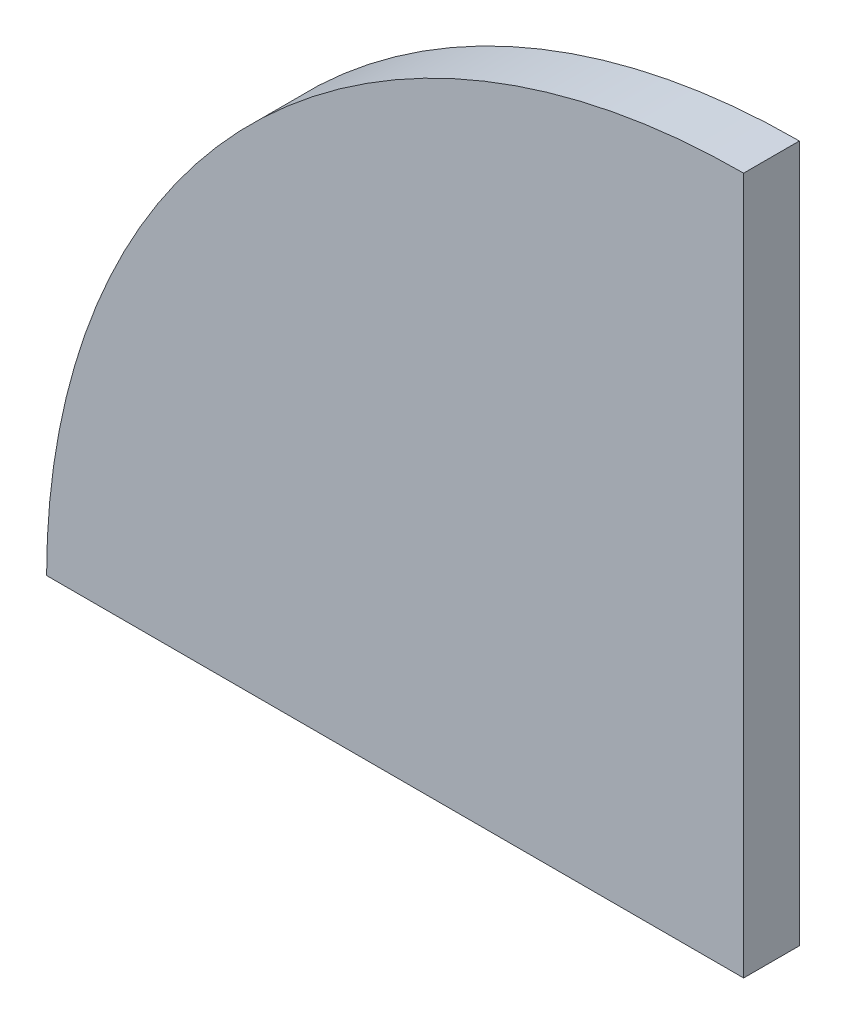
ISO-10303-21;
HEADER;
FILE_DESCRIPTION(('STEP AP214'),'2;1');
FILE_NAME('part.step','',(''),(''),'','','');
FILE_SCHEMA(('AUTOMOTIVE_DESIGN { 1 0 10303 214 1 1 1 1 }'));
ENDSEC;
DATA;
#1=APPLICATION_CONTEXT('core data for automotive mechanical design processes');
#2=APPLICATION_PROTOCOL_DEFINITION('international standard','automotive_design',2000,#1);
#3=PRODUCT_CONTEXT('',#1,'mechanical');
#4=PRODUCT('Part','Part','',(#3));
#5=PRODUCT_RELATED_PRODUCT_CATEGORY('part','',(#4));
#6=PRODUCT_DEFINITION_FORMATION('','',#4);
#7=PRODUCT_DEFINITION_CONTEXT('part definition',#1,'design');
#8=PRODUCT_DEFINITION('design','',#6,#7);
#9=PRODUCT_DEFINITION_SHAPE('','',#8);
#10=(LENGTH_UNIT() NAMED_UNIT(*) SI_UNIT(.MILLI.,.METRE.));
#11=(NAMED_UNIT(*) PLANE_ANGLE_UNIT() SI_UNIT($,.RADIAN.));
#12=(NAMED_UNIT(*) SI_UNIT($,.STERADIAN.) SOLID_ANGLE_UNIT());
#13=UNCERTAINTY_MEASURE_WITH_UNIT(LENGTH_MEASURE(1.E-05),#10,'distance_accuracy_value','');
#14=(GEOMETRIC_REPRESENTATION_CONTEXT(3) GLOBAL_UNCERTAINTY_ASSIGNED_CONTEXT((#13)) GLOBAL_UNIT_ASSIGNED_CONTEXT((#10,
#11,#12)) REPRESENTATION_CONTEXT('',''));
#15=CARTESIAN_POINT('',(0.,0.,0.));
#16=DIRECTION('',(0.,0.,1.));
#17=DIRECTION('',(1.,0.,0.));
#18=AXIS2_PLACEMENT_3D('',#15,#16,#17);
#19=CARTESIAN_POINT('',(0.,0.,2.));
#20=DIRECTION('',(0.,1.,0.));
#21=DIRECTION('',(0.,0.,1.));
#22=AXIS2_PLACEMENT_3D('',#19,#20,#21);
#23=PLANE('',#22);
#24=DIRECTION('',(1.,0.,0.));
#25=VECTOR('',#24,1.);
#26=CARTESIAN_POINT('',(0.,0.,0.));
#27=LINE('',#26,#25);
#28=CARTESIAN_POINT('',(-25.,0.,0.));
#29=VERTEX_POINT('',#28);
#30=CARTESIAN_POINT('',(0.,0.,0.));
#31=VERTEX_POINT('',#30);
#32=EDGE_CURVE('E86',#29,#31,#27,.T.);
#33=ORIENTED_EDGE('',*,*,#32,.T.);
#34=DIRECTION('',(0.,0.,-1.));
#35=VECTOR('',#34,1.);
#36=CARTESIAN_POINT('',(0.,0.,2.));
#37=LINE('',#36,#35);
#38=CARTESIAN_POINT('',(0.,0.,2.));
#39=VERTEX_POINT('',#38);
#40=EDGE_CURVE('E11',#39,#31,#37,.T.);
#41=ORIENTED_EDGE('',*,*,#40,.F.);
#42=DIRECTION('',(1.,0.,0.));
#43=VECTOR('',#42,1.);
#44=CARTESIAN_POINT('',(0.,0.,2.));
#45=LINE('',#44,#43);
#46=CARTESIAN_POINT('',(-25.,0.,2.));
#47=VERTEX_POINT('',#46);
#48=EDGE_CURVE('E79',#47,#39,#45,.T.);
#49=ORIENTED_EDGE('',*,*,#48,.F.);
#50=DIRECTION('',(0.,0.,-1.));
#51=VECTOR('',#50,1.);
#52=CARTESIAN_POINT('',(-25.,0.,2.));
#53=LINE('',#52,#51);
#54=EDGE_CURVE('E87',#47,#29,#53,.T.);
#55=ORIENTED_EDGE('',*,*,#54,.T.);
#56=EDGE_LOOP('',(#33,#41,#49,#55));
#57=FACE_BOUND('',#56,.T.);
#58=ADVANCED_FACE('F39',(#57),#23,.F.);
#59=CARTESIAN_POINT('',(0.,0.,2.));
#60=DIRECTION('',(-1.,0.,0.));
#61=DIRECTION('',(0.,0.,1.));
#62=AXIS2_PLACEMENT_3D('',#59,#60,#61);
#63=PLANE('',#62);
#64=DIRECTION('',(0.,1.,0.));
#65=VECTOR('',#64,1.);
#66=CARTESIAN_POINT('',(0.,0.,0.));
#67=LINE('',#66,#65);
#68=CARTESIAN_POINT('',(0.,25.,0.));
#69=VERTEX_POINT('',#68);
#70=EDGE_CURVE('E67',#31,#69,#67,.T.);
#71=ORIENTED_EDGE('',*,*,#70,.T.);
#72=DIRECTION('',(0.,0.,-1.));
#73=VECTOR('',#72,1.);
#74=CARTESIAN_POINT('',(0.,25.,2.));
#75=LINE('',#74,#73);
#76=CARTESIAN_POINT('',(0.,25.,2.));
#77=VERTEX_POINT('',#76);
#78=EDGE_CURVE('E47',#77,#69,#75,.T.);
#79=ORIENTED_EDGE('',*,*,#78,.F.);
#80=DIRECTION('',(0.,1.,0.));
#81=VECTOR('',#80,1.);
#82=CARTESIAN_POINT('',(0.,0.,2.));
#83=LINE('',#82,#81);
#84=EDGE_CURVE('E75',#39,#77,#83,.T.);
#85=ORIENTED_EDGE('',*,*,#84,.F.);
#86=ORIENTED_EDGE('',*,*,#40,.T.);
#87=EDGE_LOOP('',(#71,#79,#85,#86));
#88=FACE_BOUND('',#87,.T.);
#89=ADVANCED_FACE('F76',(#88),#63,.F.);
#90=CARTESIAN_POINT('',(0.,0.,2.));
#91=DIRECTION('',(0.,0.,-1.));
#92=DIRECTION('',(-1.,0.,0.));
#93=AXIS2_PLACEMENT_3D('',#90,#91,#92);
#94=CYLINDRICAL_SURFACE('',#93,25.);
#95=CARTESIAN_POINT('',(0.,0.,0.));
#96=DIRECTION('',(0.,0.,1.));
#97=DIRECTION('',(1.,0.,0.));
#98=AXIS2_PLACEMENT_3D('',#95,#96,#97);
#99=CIRCLE('',#98,25.);
#100=EDGE_CURVE('E72',#69,#29,#99,.T.);
#101=ORIENTED_EDGE('',*,*,#100,.T.);
#102=ORIENTED_EDGE('',*,*,#54,.F.);
#103=CARTESIAN_POINT('',(0.,0.,2.));
#104=DIRECTION('',(0.,0.,1.));
#105=DIRECTION('',(1.,0.,0.));
#106=AXIS2_PLACEMENT_3D('',#103,#104,#105);
#107=CIRCLE('',#106,25.);
#108=EDGE_CURVE('E55',#77,#47,#107,.T.);
#109=ORIENTED_EDGE('',*,*,#108,.F.);
#110=ORIENTED_EDGE('',*,*,#78,.T.);
#111=EDGE_LOOP('',(#101,#102,#109,#110));
#112=FACE_BOUND('',#111,.T.);
#113=ADVANCED_FACE('F94',(#112),#94,.T.);
#114=CARTESIAN_POINT('',(0.,0.,2.));
#115=DIRECTION('',(0.,0.,1.));
#116=DIRECTION('',(1.,0.,0.));
#117=AXIS2_PLACEMENT_3D('',#114,#115,#116);
#118=PLANE('',#117);
#119=ORIENTED_EDGE('',*,*,#48,.T.);
#120=ORIENTED_EDGE('',*,*,#84,.T.);
#121=ORIENTED_EDGE('',*,*,#108,.T.);
#122=EDGE_LOOP('',(#119,#120,#121));
#123=FACE_BOUND('',#122,.T.);
#124=ADVANCED_FACE('F82',(#123),#118,.T.);
#125=CARTESIAN_POINT('',(0.,0.,0.));
#126=DIRECTION('',(0.,0.,1.));
#127=DIRECTION('',(1.,0.,0.));
#128=AXIS2_PLACEMENT_3D('',#125,#126,#127);
#129=PLANE('',#128);
#130=ORIENTED_EDGE('',*,*,#32,.F.);
#131=ORIENTED_EDGE('',*,*,#100,.F.);
#132=ORIENTED_EDGE('',*,*,#70,.F.);
#133=EDGE_LOOP('',(#130,#131,#132));
#134=FACE_BOUND('',#133,.T.);
#135=ADVANCED_FACE('F95',(#134),#129,.F.);
#136=CLOSED_SHELL('',(#58,#89,#113,#124,#135));
#137=MANIFOLD_SOLID_BREP('B2',#136);
#138=ADVANCED_BREP_SHAPE_REPRESENTATION('',(#18,#137),#14);
#139=SHAPE_DEFINITION_REPRESENTATION(#9,#138);
ENDSEC;
END-ISO-10303-21;
